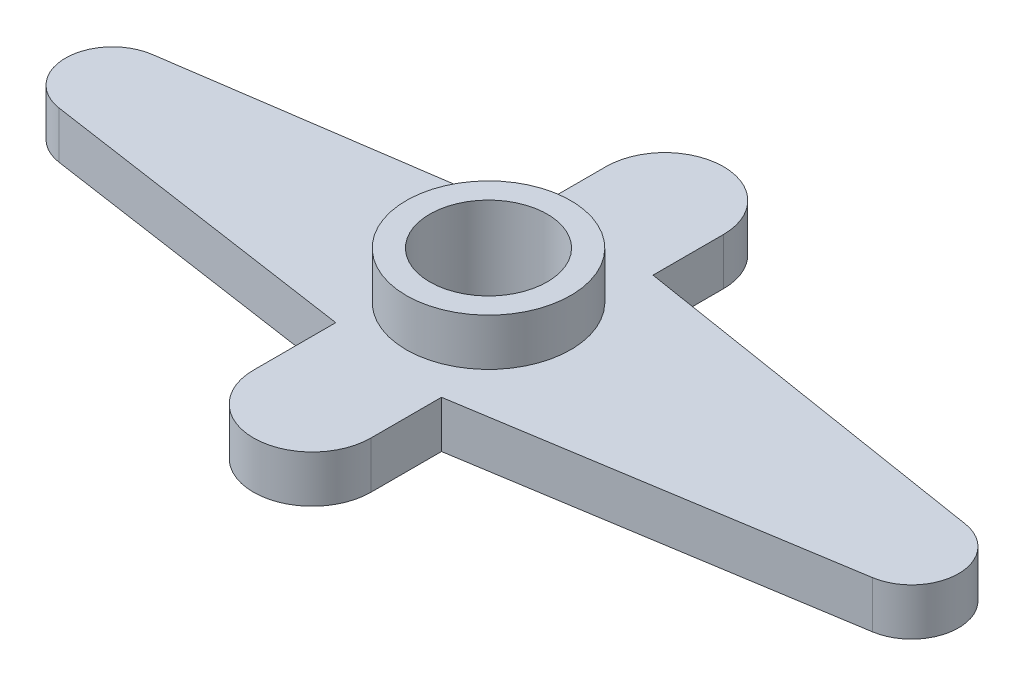
ISO-10303-21;
HEADER;
FILE_DESCRIPTION(('STEP AP214'),'2;1');
FILE_NAME('part.step','',(''),(''),'','','');
FILE_SCHEMA(('AUTOMOTIVE_DESIGN { 1 0 10303 214 1 1 1 1 }'));
ENDSEC;
DATA;
#1=APPLICATION_CONTEXT('core data for automotive mechanical design processes');
#2=APPLICATION_PROTOCOL_DEFINITION('international standard','automotive_design',2000,#1);
#3=PRODUCT_CONTEXT('',#1,'mechanical');
#4=PRODUCT('Part','Part','',(#3));
#5=PRODUCT_RELATED_PRODUCT_CATEGORY('part','',(#4));
#6=PRODUCT_DEFINITION_FORMATION('','',#4);
#7=PRODUCT_DEFINITION_CONTEXT('part definition',#1,'design');
#8=PRODUCT_DEFINITION('design','',#6,#7);
#9=PRODUCT_DEFINITION_SHAPE('','',#8);
#10=(LENGTH_UNIT() NAMED_UNIT(*) SI_UNIT(.MILLI.,.METRE.));
#11=(NAMED_UNIT(*) PLANE_ANGLE_UNIT() SI_UNIT($,.RADIAN.));
#12=(NAMED_UNIT(*) SI_UNIT($,.STERADIAN.) SOLID_ANGLE_UNIT());
#13=UNCERTAINTY_MEASURE_WITH_UNIT(LENGTH_MEASURE(1.E-05),#10,'distance_accuracy_value','');
#14=(GEOMETRIC_REPRESENTATION_CONTEXT(3) GLOBAL_UNCERTAINTY_ASSIGNED_CONTEXT((#13)) GLOBAL_UNIT_ASSIGNED_CONTEXT((#10,
#11,#12)) REPRESENTATION_CONTEXT('',''));
#15=CARTESIAN_POINT('',(0.,0.,0.));
#16=DIRECTION('',(0.,0.,1.));
#17=DIRECTION('',(1.,0.,0.));
#18=AXIS2_PLACEMENT_3D('',#15,#16,#17);
#19=CARTESIAN_POINT('',(0.,4.,0.));
#20=DIRECTION('',(0.,1.,0.));
#21=DIRECTION('',(0.,0.,1.));
#22=AXIS2_PLACEMENT_3D('',#19,#20,#21);
#23=PLANE('',#22);
#24=CARTESIAN_POINT('',(0.,4.,0.));
#25=DIRECTION('',(0.,1.,0.));
#26=DIRECTION('',(0.,0.,1.));
#27=AXIS2_PLACEMENT_3D('',#24,#25,#26);
#28=CIRCLE('',#27,3.5);
#29=CARTESIAN_POINT('',(0.,4.,3.5));
#30=VERTEX_POINT('',#29);
#31=EDGE_CURVE('E11',#30,#30,#28,.T.);
#32=ORIENTED_EDGE('',*,*,#31,.T.);
#33=EDGE_LOOP('',(#32));
#34=FACE_BOUND('',#33,.T.);
#35=CARTESIAN_POINT('',(0.,4.,0.));
#36=DIRECTION('',(0.,1.,0.));
#37=DIRECTION('',(0.,0.,1.));
#38=AXIS2_PLACEMENT_3D('',#35,#36,#37);
#39=CIRCLE('',#38,2.5);
#40=CARTESIAN_POINT('',(0.,4.,2.5));
#41=VERTEX_POINT('',#40);
#42=EDGE_CURVE('E53',#41,#41,#39,.T.);
#43=ORIENTED_EDGE('',*,*,#42,.F.);
#44=EDGE_LOOP('',(#43));
#45=FACE_BOUND('',#44,.T.);
#46=ADVANCED_FACE('F43',(#34,#45),#23,.T.);
#47=CARTESIAN_POINT('',(0.,0.,0.));
#48=DIRECTION('',(0.,1.,0.));
#49=DIRECTION('',(0.,0.,1.));
#50=AXIS2_PLACEMENT_3D('',#47,#48,#49);
#51=PLANE('',#50);
#52=CARTESIAN_POINT('',(0.,0.,0.));
#53=DIRECTION('',(0.,1.,0.));
#54=DIRECTION('',(0.,0.,1.));
#55=AXIS2_PLACEMENT_3D('',#52,#53,#54);
#56=CIRCLE('',#55,2.5);
#57=CARTESIAN_POINT('',(0.,0.,2.5));
#58=VERTEX_POINT('',#57);
#59=EDGE_CURVE('E248',#58,#58,#56,.T.);
#60=ORIENTED_EDGE('',*,*,#59,.T.);
#61=EDGE_LOOP('',(#60));
#62=FACE_BOUND('',#61,.T.);
#63=DIRECTION('',(-0.989429297222425,0.,-0.145016088065904));
#64=VECTOR('',#63,1.);
#65=CARTESIAN_POINT('',(-0.626506828898815,0.,4.27458925206073));
#66=LINE('',#65,#64);
#67=CARTESIAN_POINT('',(-2.5,0.,4.));
#68=VERTEX_POINT('',#67);
#69=CARTESIAN_POINT('',(-16.2900321761318,0.,1.97885859444485));
#70=VERTEX_POINT('',#69);
#71=EDGE_CURVE('E171',#68,#70,#66,.T.);
#72=ORIENTED_EDGE('',*,*,#71,.T.);
#73=CARTESIAN_POINT('',(-16.,0.,0.));
#74=DIRECTION('',(0.,1.,0.));
#75=DIRECTION('',(0.,0.,1.));
#76=AXIS2_PLACEMENT_3D('',#73,#74,#75);
#77=CIRCLE('',#76,2.);
#78=CARTESIAN_POINT('',(-16.2900321761318,0.,-1.97885859444485));
#79=VERTEX_POINT('',#78);
#80=EDGE_CURVE('E208',#79,#70,#77,.T.);
#81=ORIENTED_EDGE('',*,*,#80,.F.);
#82=DIRECTION('',(-0.989429297222425,0.,0.145016088065904));
#83=VECTOR('',#82,1.);
#84=CARTESIAN_POINT('',(-0.626506828898815,0.,-4.27458925206073));
#85=LINE('',#84,#83);
#86=CARTESIAN_POINT('',(-2.5,0.,-4.));
#87=VERTEX_POINT('',#86);
#88=EDGE_CURVE('E101',#87,#79,#85,.T.);
#89=ORIENTED_EDGE('',*,*,#88,.F.);
#90=DIRECTION('',(0.,0.,-1.));
#91=VECTOR('',#90,1.);
#92=CARTESIAN_POINT('',(-2.5,0.,0.));
#93=LINE('',#92,#91);
#94=CARTESIAN_POINT('',(-2.5,0.,-7.5));
#95=VERTEX_POINT('',#94);
#96=EDGE_CURVE('E148',#87,#95,#93,.T.);
#97=ORIENTED_EDGE('',*,*,#96,.T.);
#98=CARTESIAN_POINT('',(0.,0.,-7.5));
#99=DIRECTION('',(0.,1.,0.));
#100=DIRECTION('',(0.,0.,1.));
#101=AXIS2_PLACEMENT_3D('',#98,#99,#100);
#102=CIRCLE('',#101,2.5);
#103=CARTESIAN_POINT('',(2.5,0.,-7.5));
#104=VERTEX_POINT('',#103);
#105=EDGE_CURVE('E200',#95,#104,#102,.F.);
#106=ORIENTED_EDGE('',*,*,#105,.T.);
#107=DIRECTION('',(0.,0.,1.));
#108=VECTOR('',#107,1.);
#109=CARTESIAN_POINT('',(2.5,0.,0.));
#110=LINE('',#109,#108);
#111=CARTESIAN_POINT('',(2.5,0.,-4.5));
#112=VERTEX_POINT('',#111);
#113=EDGE_CURVE('E196',#104,#112,#110,.T.);
#114=ORIENTED_EDGE('',*,*,#113,.T.);
#115=DIRECTION('',(0.987493548405866,0.,0.157659417279122));
#116=VECTOR('',#115,1.);
#117=CARTESIAN_POINT('',(0.762735687980508,0.,-4.77736493016584));
#118=LINE('',#117,#116);
#119=CARTESIAN_POINT('',(18.3153188345582,0.,-1.97498709681173));
#120=VERTEX_POINT('',#119);
#121=EDGE_CURVE('E192',#112,#120,#118,.T.);
#122=ORIENTED_EDGE('',*,*,#121,.T.);
#123=CARTESIAN_POINT('',(18.,0.,0.));
#124=DIRECTION('',(0.,1.,0.));
#125=DIRECTION('',(0.,0.,1.));
#126=AXIS2_PLACEMENT_3D('',#123,#124,#125);
#127=CIRCLE('',#126,2.);
#128=CARTESIAN_POINT('',(18.3153188345582,0.,1.97498709681173));
#129=VERTEX_POINT('',#128);
#130=EDGE_CURVE('E188',#120,#129,#127,.F.);
#131=ORIENTED_EDGE('',*,*,#130,.T.);
#132=DIRECTION('',(0.987493548405866,0.,-0.157659417279122));
#133=VECTOR('',#132,1.);
#134=CARTESIAN_POINT('',(0.762735687980508,0.,4.77736493016584));
#135=LINE('',#134,#133);
#136=CARTESIAN_POINT('',(2.5,0.,4.5));
#137=VERTEX_POINT('',#136);
#138=EDGE_CURVE('E184',#137,#129,#135,.T.);
#139=ORIENTED_EDGE('',*,*,#138,.F.);
#140=DIRECTION('',(0.,0.,-1.));
#141=VECTOR('',#140,1.);
#142=CARTESIAN_POINT('',(2.5,0.,0.));
#143=LINE('',#142,#141);
#144=CARTESIAN_POINT('',(2.5,0.,7.5));
#145=VERTEX_POINT('',#144);
#146=EDGE_CURVE('E181',#145,#137,#143,.T.);
#147=ORIENTED_EDGE('',*,*,#146,.F.);
#148=CARTESIAN_POINT('',(0.,0.,7.5));
#149=DIRECTION('',(0.,1.,0.));
#150=DIRECTION('',(0.,0.,1.));
#151=AXIS2_PLACEMENT_3D('',#148,#149,#150);
#152=CIRCLE('',#151,2.5);
#153=CARTESIAN_POINT('',(-2.5,0.,7.5));
#154=VERTEX_POINT('',#153);
#155=EDGE_CURVE('E178',#154,#145,#152,.T.);
#156=ORIENTED_EDGE('',*,*,#155,.F.);
#157=DIRECTION('',(0.,0.,1.));
#158=VECTOR('',#157,1.);
#159=CARTESIAN_POINT('',(-2.5,0.,0.));
#160=LINE('',#159,#158);
#161=EDGE_CURVE('E175',#68,#154,#160,.T.);
#162=ORIENTED_EDGE('',*,*,#161,.F.);
#163=EDGE_LOOP('',(#72,#81,#89,#97,#106,#114,#122,#131,#139,#147,#156,#162));
#164=FACE_BOUND('',#163,.T.);
#165=ADVANCED_FACE('F255',(#62,#164),#51,.F.);
#166=CARTESIAN_POINT('',(0.,4.,0.));
#167=DIRECTION('',(0.,-1.,0.));
#168=DIRECTION('',(0.,0.,-1.));
#169=AXIS2_PLACEMENT_3D('',#166,#167,#168);
#170=CYLINDRICAL_SURFACE('',#169,3.5);
#171=CARTESIAN_POINT('',(0.,2.,0.));
#172=DIRECTION('',(0.,1.,0.));
#173=DIRECTION('',(0.,0.,1.));
#174=AXIS2_PLACEMENT_3D('',#171,#172,#173);
#175=CIRCLE('',#174,3.5);
#176=CARTESIAN_POINT('',(0.,2.,3.5));
#177=VERTEX_POINT('',#176);
#178=EDGE_CURVE('E244',#177,#177,#175,.T.);
#179=ORIENTED_EDGE('',*,*,#178,.T.);
#180=EDGE_LOOP('',(#179));
#181=FACE_BOUND('',#180,.T.);
#182=ORIENTED_EDGE('',*,*,#31,.F.);
#183=EDGE_LOOP('',(#182));
#184=FACE_BOUND('',#183,.T.);
#185=ADVANCED_FACE('F45',(#181,#184),#170,.T.);
#186=CARTESIAN_POINT('',(0.,4.,0.));
#187=DIRECTION('',(0.,-1.,0.));
#188=DIRECTION('',(0.,0.,-1.));
#189=AXIS2_PLACEMENT_3D('',#186,#187,#188);
#190=CYLINDRICAL_SURFACE('',#189,2.5);
#191=ORIENTED_EDGE('',*,*,#59,.F.);
#192=EDGE_LOOP('',(#191));
#193=FACE_BOUND('',#192,.T.);
#194=ORIENTED_EDGE('',*,*,#42,.T.);
#195=EDGE_LOOP('',(#194));
#196=FACE_BOUND('',#195,.T.);
#197=ADVANCED_FACE('F258',(#193,#196),#190,.F.);
#198=CARTESIAN_POINT('',(-0.626506828898815,2.,4.27458925206073));
#199=DIRECTION('',(-0.145016088065904,0.,0.989429297222425));
#200=DIRECTION('',(0.989429297222425,0.,0.145016088065904));
#201=AXIS2_PLACEMENT_3D('',#198,#199,#200);
#202=PLANE('',#201);
#203=ORIENTED_EDGE('',*,*,#71,.F.);
#204=DIRECTION('',(0.,-1.,0.));
#205=VECTOR('',#204,1.);
#206=CARTESIAN_POINT('',(-2.5,2.,4.));
#207=LINE('',#206,#205);
#208=CARTESIAN_POINT('',(-2.5,2.,4.));
#209=VERTEX_POINT('',#208);
#210=EDGE_CURVE('E113',#209,#68,#207,.T.);
#211=ORIENTED_EDGE('',*,*,#210,.F.);
#212=DIRECTION('',(-0.989429297222425,0.,-0.145016088065904));
#213=VECTOR('',#212,1.);
#214=CARTESIAN_POINT('',(-0.626506828898815,2.,4.27458925206073));
#215=LINE('',#214,#213);
#216=CARTESIAN_POINT('',(-16.2900321761318,2.,1.97885859444485));
#217=VERTEX_POINT('',#216);
#218=EDGE_CURVE('E211',#209,#217,#215,.T.);
#219=ORIENTED_EDGE('',*,*,#218,.T.);
#220=DIRECTION('',(0.,-1.,0.));
#221=VECTOR('',#220,1.);
#222=CARTESIAN_POINT('',(-16.2900321761318,2.,1.97885859444485));
#223=LINE('',#222,#221);
#224=EDGE_CURVE('E108',#217,#70,#223,.T.);
#225=ORIENTED_EDGE('',*,*,#224,.T.);
#226=EDGE_LOOP('',(#203,#211,#219,#225));
#227=FACE_BOUND('',#226,.T.);
#228=ADVANCED_FACE('F261',(#227),#202,.T.);
#229=CARTESIAN_POINT('',(-2.5,2.,0.));
#230=DIRECTION('',(1.,0.,0.));
#231=DIRECTION('',(0.,0.,-1.));
#232=AXIS2_PLACEMENT_3D('',#229,#230,#231);
#233=PLANE('',#232);
#234=ORIENTED_EDGE('',*,*,#161,.T.);
#235=DIRECTION('',(0.,-1.,0.));
#236=VECTOR('',#235,1.);
#237=CARTESIAN_POINT('',(-2.5,2.,7.5));
#238=LINE('',#237,#236);
#239=CARTESIAN_POINT('',(-2.5,2.,7.5));
#240=VERTEX_POINT('',#239);
#241=EDGE_CURVE('E238',#240,#154,#238,.T.);
#242=ORIENTED_EDGE('',*,*,#241,.F.);
#243=DIRECTION('',(0.,0.,1.));
#244=VECTOR('',#243,1.);
#245=CARTESIAN_POINT('',(-2.5,2.,0.));
#246=LINE('',#245,#244);
#247=EDGE_CURVE('E465',#209,#240,#246,.T.);
#248=ORIENTED_EDGE('',*,*,#247,.F.);
#249=ORIENTED_EDGE('',*,*,#210,.T.);
#250=EDGE_LOOP('',(#234,#242,#248,#249));
#251=FACE_BOUND('',#250,.T.);
#252=ADVANCED_FACE('F275',(#251),#233,.F.);
#253=CARTESIAN_POINT('',(0.,2.,7.5));
#254=DIRECTION('',(0.,-1.,0.));
#255=DIRECTION('',(0.,0.,-1.));
#256=AXIS2_PLACEMENT_3D('',#253,#254,#255);
#257=CYLINDRICAL_SURFACE('',#256,2.5);
#258=ORIENTED_EDGE('',*,*,#155,.T.);
#259=DIRECTION('',(0.,-1.,0.));
#260=VECTOR('',#259,1.);
#261=CARTESIAN_POINT('',(2.5,2.,7.5));
#262=LINE('',#261,#260);
#263=CARTESIAN_POINT('',(2.5,2.,7.5));
#264=VERTEX_POINT('',#263);
#265=EDGE_CURVE('E234',#264,#145,#262,.T.);
#266=ORIENTED_EDGE('',*,*,#265,.F.);
#267=CARTESIAN_POINT('',(0.,2.,7.5));
#268=DIRECTION('',(0.,1.,0.));
#269=DIRECTION('',(0.,0.,1.));
#270=AXIS2_PLACEMENT_3D('',#267,#268,#269);
#271=CIRCLE('',#270,2.5);
#272=EDGE_CURVE('E461',#240,#264,#271,.T.);
#273=ORIENTED_EDGE('',*,*,#272,.F.);
#274=ORIENTED_EDGE('',*,*,#241,.T.);
#275=EDGE_LOOP('',(#258,#266,#273,#274));
#276=FACE_BOUND('',#275,.T.);
#277=ADVANCED_FACE('F278',(#276),#257,.T.);
#278=CARTESIAN_POINT('',(2.5,2.,0.));
#279=DIRECTION('',(-1.,0.,0.));
#280=DIRECTION('',(0.,0.,1.));
#281=AXIS2_PLACEMENT_3D('',#278,#279,#280);
#282=PLANE('',#281);
#283=ORIENTED_EDGE('',*,*,#146,.T.);
#284=DIRECTION('',(0.,-1.,0.));
#285=VECTOR('',#284,1.);
#286=CARTESIAN_POINT('',(2.5,2.,4.5));
#287=LINE('',#286,#285);
#288=CARTESIAN_POINT('',(2.5,2.,4.5));
#289=VERTEX_POINT('',#288);
#290=EDGE_CURVE('E230',#289,#137,#287,.T.);
#291=ORIENTED_EDGE('',*,*,#290,.F.);
#292=DIRECTION('',(0.,0.,-1.));
#293=VECTOR('',#292,1.);
#294=CARTESIAN_POINT('',(2.5,2.,0.));
#295=LINE('',#294,#293);
#296=EDGE_CURVE('E464',#264,#289,#295,.T.);
#297=ORIENTED_EDGE('',*,*,#296,.F.);
#298=ORIENTED_EDGE('',*,*,#265,.T.);
#299=EDGE_LOOP('',(#283,#291,#297,#298));
#300=FACE_BOUND('',#299,.T.);
#301=ADVANCED_FACE('F282',(#300),#282,.F.);
#302=CARTESIAN_POINT('',(0.762735687980508,2.,4.77736493016584));
#303=DIRECTION('',(-0.157659417279122,0.,-0.987493548405866));
#304=DIRECTION('',(-0.987493548405866,0.,0.157659417279122));
#305=AXIS2_PLACEMENT_3D('',#302,#303,#304);
#306=PLANE('',#305);
#307=ORIENTED_EDGE('',*,*,#138,.T.);
#308=DIRECTION('',(0.,-1.,0.));
#309=VECTOR('',#308,1.);
#310=CARTESIAN_POINT('',(18.3153188345582,2.,1.97498709681173));
#311=LINE('',#310,#309);
#312=CARTESIAN_POINT('',(18.3153188345582,2.,1.97498709681173));
#313=VERTEX_POINT('',#312);
#314=EDGE_CURVE('E227',#313,#129,#311,.T.);
#315=ORIENTED_EDGE('',*,*,#314,.F.);
#316=DIRECTION('',(0.987493548405866,0.,-0.157659417279122));
#317=VECTOR('',#316,1.);
#318=CARTESIAN_POINT('',(0.762735687980508,2.,4.77736493016584));
#319=LINE('',#318,#317);
#320=EDGE_CURVE('E469',#289,#313,#319,.T.);
#321=ORIENTED_EDGE('',*,*,#320,.F.);
#322=ORIENTED_EDGE('',*,*,#290,.T.);
#323=EDGE_LOOP('',(#307,#315,#321,#322));
#324=FACE_BOUND('',#323,.T.);
#325=ADVANCED_FACE('F286',(#324),#306,.F.);
#326=CARTESIAN_POINT('',(18.,2.,0.));
#327=DIRECTION('',(0.,-1.,0.));
#328=DIRECTION('',(0.,0.,-1.));
#329=AXIS2_PLACEMENT_3D('',#326,#327,#328);
#330=CYLINDRICAL_SURFACE('',#329,2.);
#331=ORIENTED_EDGE('',*,*,#130,.F.);
#332=DIRECTION('',(0.,-1.,0.));
#333=VECTOR('',#332,1.);
#334=CARTESIAN_POINT('',(18.3153188345582,2.,-1.97498709681173));
#335=LINE('',#334,#333);
#336=CARTESIAN_POINT('',(18.3153188345582,2.,-1.97498709681173));
#337=VERTEX_POINT('',#336);
#338=EDGE_CURVE('E224',#337,#120,#335,.T.);
#339=ORIENTED_EDGE('',*,*,#338,.F.);
#340=CARTESIAN_POINT('',(18.,2.,0.));
#341=DIRECTION('',(0.,1.,0.));
#342=DIRECTION('',(0.,0.,1.));
#343=AXIS2_PLACEMENT_3D('',#340,#341,#342);
#344=CIRCLE('',#343,2.);
#345=EDGE_CURVE('E476',#337,#313,#344,.F.);
#346=ORIENTED_EDGE('',*,*,#345,.T.);
#347=ORIENTED_EDGE('',*,*,#314,.T.);
#348=EDGE_LOOP('',(#331,#339,#346,#347));
#349=FACE_BOUND('',#348,.T.);
#350=ADVANCED_FACE('F290',(#349),#330,.T.);
#351=CARTESIAN_POINT('',(0.762735687980508,2.,-4.77736493016584));
#352=DIRECTION('',(0.157659417279122,0.,-0.987493548405866));
#353=DIRECTION('',(-0.987493548405866,0.,-0.157659417279122));
#354=AXIS2_PLACEMENT_3D('',#351,#352,#353);
#355=PLANE('',#354);
#356=ORIENTED_EDGE('',*,*,#121,.F.);
#357=DIRECTION('',(0.,-1.,0.));
#358=VECTOR('',#357,1.);
#359=CARTESIAN_POINT('',(2.5,2.,-4.5));
#360=LINE('',#359,#358);
#361=CARTESIAN_POINT('',(2.5,2.,-4.5));
#362=VERTEX_POINT('',#361);
#363=EDGE_CURVE('E221',#362,#112,#360,.T.);
#364=ORIENTED_EDGE('',*,*,#363,.F.);
#365=DIRECTION('',(0.987493548405866,0.,0.157659417279122));
#366=VECTOR('',#365,1.);
#367=CARTESIAN_POINT('',(0.762735687980508,2.,-4.77736493016584));
#368=LINE('',#367,#366);
#369=EDGE_CURVE('E480',#362,#337,#368,.T.);
#370=ORIENTED_EDGE('',*,*,#369,.T.);
#371=ORIENTED_EDGE('',*,*,#338,.T.);
#372=EDGE_LOOP('',(#356,#364,#370,#371));
#373=FACE_BOUND('',#372,.T.);
#374=ADVANCED_FACE('F294',(#373),#355,.T.);
#375=CARTESIAN_POINT('',(2.5,2.,0.));
#376=DIRECTION('',(1.,0.,0.));
#377=DIRECTION('',(0.,0.,-1.));
#378=AXIS2_PLACEMENT_3D('',#375,#376,#377);
#379=PLANE('',#378);
#380=ORIENTED_EDGE('',*,*,#113,.F.);
#381=DIRECTION('',(0.,-1.,0.));
#382=VECTOR('',#381,1.);
#383=CARTESIAN_POINT('',(2.5,2.,-7.5));
#384=LINE('',#383,#382);
#385=CARTESIAN_POINT('',(2.5,2.,-7.5));
#386=VERTEX_POINT('',#385);
#387=EDGE_CURVE('E218',#386,#104,#384,.T.);
#388=ORIENTED_EDGE('',*,*,#387,.F.);
#389=DIRECTION('',(0.,0.,1.));
#390=VECTOR('',#389,1.);
#391=CARTESIAN_POINT('',(2.5,2.,0.));
#392=LINE('',#391,#390);
#393=EDGE_CURVE('E165',#386,#362,#392,.T.);
#394=ORIENTED_EDGE('',*,*,#393,.T.);
#395=ORIENTED_EDGE('',*,*,#363,.T.);
#396=EDGE_LOOP('',(#380,#388,#394,#395));
#397=FACE_BOUND('',#396,.T.);
#398=ADVANCED_FACE('F298',(#397),#379,.T.);
#399=CARTESIAN_POINT('',(0.,2.,-7.5));
#400=DIRECTION('',(0.,-1.,0.));
#401=DIRECTION('',(0.,0.,-1.));
#402=AXIS2_PLACEMENT_3D('',#399,#400,#401);
#403=CYLINDRICAL_SURFACE('',#402,2.5);
#404=ORIENTED_EDGE('',*,*,#105,.F.);
#405=DIRECTION('',(0.,-1.,0.));
#406=VECTOR('',#405,1.);
#407=CARTESIAN_POINT('',(-2.5,2.,-7.5));
#408=LINE('',#407,#406);
#409=CARTESIAN_POINT('',(-2.5,2.,-7.5));
#410=VERTEX_POINT('',#409);
#411=EDGE_CURVE('E150',#410,#95,#408,.T.);
#412=ORIENTED_EDGE('',*,*,#411,.F.);
#413=CARTESIAN_POINT('',(0.,2.,-7.5));
#414=DIRECTION('',(0.,1.,0.));
#415=DIRECTION('',(0.,0.,1.));
#416=AXIS2_PLACEMENT_3D('',#413,#414,#415);
#417=CIRCLE('',#416,2.5);
#418=EDGE_CURVE('E161',#410,#386,#417,.F.);
#419=ORIENTED_EDGE('',*,*,#418,.T.);
#420=ORIENTED_EDGE('',*,*,#387,.T.);
#421=EDGE_LOOP('',(#404,#412,#419,#420));
#422=FACE_BOUND('',#421,.T.);
#423=ADVANCED_FACE('F302',(#422),#403,.T.);
#424=CARTESIAN_POINT('',(-2.5,2.,0.));
#425=DIRECTION('',(-1.,0.,0.));
#426=DIRECTION('',(0.,0.,1.));
#427=AXIS2_PLACEMENT_3D('',#424,#425,#426);
#428=PLANE('',#427);
#429=ORIENTED_EDGE('',*,*,#96,.F.);
#430=DIRECTION('',(0.,-1.,0.));
#431=VECTOR('',#430,1.);
#432=CARTESIAN_POINT('',(-2.5,2.,-4.));
#433=LINE('',#432,#431);
#434=CARTESIAN_POINT('',(-2.5,2.,-4.));
#435=VERTEX_POINT('',#434);
#436=EDGE_CURVE('E142',#435,#87,#433,.T.);
#437=ORIENTED_EDGE('',*,*,#436,.F.);
#438=DIRECTION('',(0.,0.,-1.));
#439=VECTOR('',#438,1.);
#440=CARTESIAN_POINT('',(-2.5,2.,0.));
#441=LINE('',#440,#439);
#442=EDGE_CURVE('E146',#435,#410,#441,.T.);
#443=ORIENTED_EDGE('',*,*,#442,.T.);
#444=ORIENTED_EDGE('',*,*,#411,.T.);
#445=EDGE_LOOP('',(#429,#437,#443,#444));
#446=FACE_BOUND('',#445,.T.);
#447=ADVANCED_FACE('F144',(#446),#428,.T.);
#448=CARTESIAN_POINT('',(-0.626506828898815,2.,-4.27458925206073));
#449=DIRECTION('',(0.145016088065904,0.,0.989429297222425));
#450=DIRECTION('',(0.989429297222425,0.,-0.145016088065904));
#451=AXIS2_PLACEMENT_3D('',#448,#449,#450);
#452=PLANE('',#451);
#453=ORIENTED_EDGE('',*,*,#88,.T.);
#454=DIRECTION('',(0.,-1.,0.));
#455=VECTOR('',#454,1.);
#456=CARTESIAN_POINT('',(-16.2900321761318,2.,-1.97885859444485));
#457=LINE('',#456,#455);
#458=CARTESIAN_POINT('',(-16.2900321761318,2.,-1.97885859444485));
#459=VERTEX_POINT('',#458);
#460=EDGE_CURVE('E151',#459,#79,#457,.T.);
#461=ORIENTED_EDGE('',*,*,#460,.F.);
#462=DIRECTION('',(-0.989429297222425,0.,0.145016088065904));
#463=VECTOR('',#462,1.);
#464=CARTESIAN_POINT('',(-0.626506828898815,2.,-4.27458925206073));
#465=LINE('',#464,#463);
#466=EDGE_CURVE('E153',#435,#459,#465,.T.);
#467=ORIENTED_EDGE('',*,*,#466,.F.);
#468=ORIENTED_EDGE('',*,*,#436,.T.);
#469=EDGE_LOOP('',(#453,#461,#467,#468));
#470=FACE_BOUND('',#469,.T.);
#471=ADVANCED_FACE('F154',(#470),#452,.F.);
#472=CARTESIAN_POINT('',(-16.,2.,0.));
#473=DIRECTION('',(0.,-1.,0.));
#474=DIRECTION('',(0.,0.,-1.));
#475=AXIS2_PLACEMENT_3D('',#472,#473,#474);
#476=CYLINDRICAL_SURFACE('',#475,2.);
#477=ORIENTED_EDGE('',*,*,#80,.T.);
#478=ORIENTED_EDGE('',*,*,#224,.F.);
#479=CARTESIAN_POINT('',(-16.,2.,0.));
#480=DIRECTION('',(0.,1.,0.));
#481=DIRECTION('',(0.,0.,1.));
#482=AXIS2_PLACEMENT_3D('',#479,#480,#481);
#483=CIRCLE('',#482,2.);
#484=EDGE_CURVE('E61',#459,#217,#483,.T.);
#485=ORIENTED_EDGE('',*,*,#484,.F.);
#486=ORIENTED_EDGE('',*,*,#460,.T.);
#487=EDGE_LOOP('',(#477,#478,#485,#486));
#488=FACE_BOUND('',#487,.T.);
#489=ADVANCED_FACE('F311',(#488),#476,.T.);
#490=CARTESIAN_POINT('',(0.,2.,0.));
#491=DIRECTION('',(0.,1.,0.));
#492=DIRECTION('',(0.,0.,1.));
#493=AXIS2_PLACEMENT_3D('',#490,#491,#492);
#494=PLANE('',#493);
#495=ORIENTED_EDGE('',*,*,#178,.F.);
#496=EDGE_LOOP('',(#495));
#497=FACE_BOUND('',#496,.T.);
#498=ORIENTED_EDGE('',*,*,#218,.F.);
#499=ORIENTED_EDGE('',*,*,#247,.T.);
#500=ORIENTED_EDGE('',*,*,#272,.T.);
#501=ORIENTED_EDGE('',*,*,#296,.T.);
#502=ORIENTED_EDGE('',*,*,#320,.T.);
#503=ORIENTED_EDGE('',*,*,#345,.F.);
#504=ORIENTED_EDGE('',*,*,#369,.F.);
#505=ORIENTED_EDGE('',*,*,#393,.F.);
#506=ORIENTED_EDGE('',*,*,#418,.F.);
#507=ORIENTED_EDGE('',*,*,#442,.F.);
#508=ORIENTED_EDGE('',*,*,#466,.T.);
#509=ORIENTED_EDGE('',*,*,#484,.T.);
#510=EDGE_LOOP('',(#498,#499,#500,#501,#502,#503,#504,#505,#506,#507,#508,#509));
#511=FACE_BOUND('',#510,.T.);
#512=ADVANCED_FACE('F158',(#497,#511),#494,.T.);
#513=CLOSED_SHELL('',(#46,#165,#185,#197,#228,#252,#277,#301,#325,#350,#374,#398,#423,#447,#471,
#489,#512));
#514=MANIFOLD_SOLID_BREP('B2',#513);
#515=ADVANCED_BREP_SHAPE_REPRESENTATION('',(#18,#514),#14);
#516=SHAPE_DEFINITION_REPRESENTATION(#9,#515);
ENDSEC;
END-ISO-10303-21;
